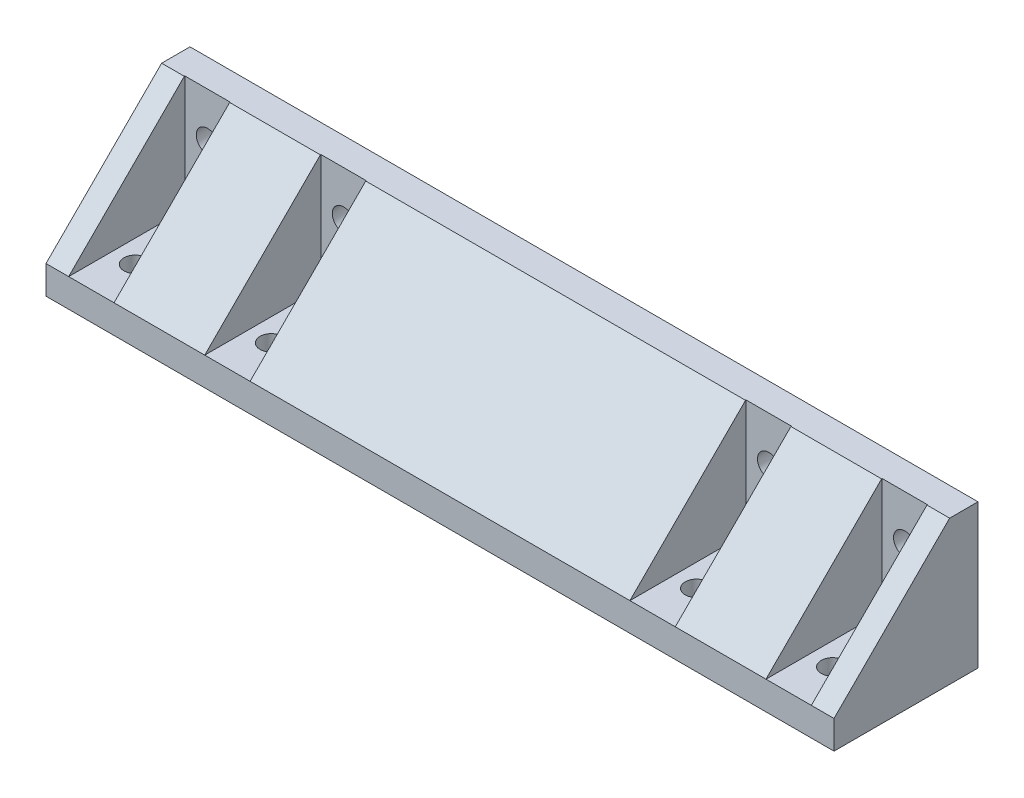
ISO-10303-21;
HEADER;
FILE_DESCRIPTION(('STEP AP214'),'2;1');
FILE_NAME('part.step','',(''),(''),'','','');
FILE_SCHEMA(('AUTOMOTIVE_DESIGN { 1 0 10303 214 1 1 1 1 }'));
ENDSEC;
DATA;
#1=APPLICATION_CONTEXT('core data for automotive mechanical design processes');
#2=APPLICATION_PROTOCOL_DEFINITION('international standard','automotive_design',2000,#1);
#3=PRODUCT_CONTEXT('',#1,'mechanical');
#4=PRODUCT('Part','Part','',(#3));
#5=PRODUCT_RELATED_PRODUCT_CATEGORY('part','',(#4));
#6=PRODUCT_DEFINITION_FORMATION('','',#4);
#7=PRODUCT_DEFINITION_CONTEXT('part definition',#1,'design');
#8=PRODUCT_DEFINITION('design','',#6,#7);
#9=PRODUCT_DEFINITION_SHAPE('','',#8);
#10=(LENGTH_UNIT() NAMED_UNIT(*) SI_UNIT(.MILLI.,.METRE.));
#11=(NAMED_UNIT(*) PLANE_ANGLE_UNIT() SI_UNIT($,.RADIAN.));
#12=(NAMED_UNIT(*) SI_UNIT($,.STERADIAN.) SOLID_ANGLE_UNIT());
#13=UNCERTAINTY_MEASURE_WITH_UNIT(LENGTH_MEASURE(1.E-05),#10,'distance_accuracy_value','');
#14=(GEOMETRIC_REPRESENTATION_CONTEXT(3) GLOBAL_UNCERTAINTY_ASSIGNED_CONTEXT((#13)) GLOBAL_UNIT_ASSIGNED_CONTEXT((#10,
#11,#12)) REPRESENTATION_CONTEXT('',''));
#15=CARTESIAN_POINT('',(0.,0.,0.));
#16=DIRECTION('',(0.,0.,1.));
#17=DIRECTION('',(1.,0.,0.));
#18=AXIS2_PLACEMENT_3D('',#15,#16,#17);
#19=CARTESIAN_POINT('',(0.,25.4,0.));
#20=DIRECTION('',(0.,1.,0.));
#21=DIRECTION('',(0.,0.,1.));
#22=AXIS2_PLACEMENT_3D('',#19,#20,#21);
#23=PLANE('',#22);
#24=DIRECTION('',(1.,0.,0.));
#25=VECTOR('',#24,1.);
#26=CARTESIAN_POINT('',(0.,25.4,-20.4));
#27=LINE('',#26,#25);
#28=CARTESIAN_POINT('',(0.,25.4,-20.4));
#29=VERTEX_POINT('',#28);
#30=CARTESIAN_POINT('',(4.,25.4,-20.4));
#31=VERTEX_POINT('',#30);
#32=EDGE_CURVE('E320',#29,#31,#27,.T.);
#33=ORIENTED_EDGE('',*,*,#32,.T.);
#34=DIRECTION('',(0.,0.,1.));
#35=VECTOR('',#34,1.);
#36=CARTESIAN_POINT('',(4.,25.4,-20.5));
#37=LINE('',#36,#35);
#38=CARTESIAN_POINT('',(4.,25.4,-20.5));
#39=VERTEX_POINT('',#38);
#40=EDGE_CURVE('E215',#39,#31,#37,.T.);
#41=ORIENTED_EDGE('',*,*,#40,.F.);
#42=DIRECTION('',(1.,0.,0.));
#43=VECTOR('',#42,1.);
#44=CARTESIAN_POINT('',(0.,25.4,-20.5));
#45=LINE('',#44,#43);
#46=CARTESIAN_POINT('',(12.,25.4,-20.5));
#47=VERTEX_POINT('',#46);
#48=EDGE_CURVE('E204',#39,#47,#45,.T.);
#49=ORIENTED_EDGE('',*,*,#48,.T.);
#50=DIRECTION('',(0.,0.,1.));
#51=VECTOR('',#50,1.);
#52=CARTESIAN_POINT('',(12.,25.4,-20.5));
#53=LINE('',#52,#51);
#54=CARTESIAN_POINT('',(12.,25.4,-20.4));
#55=VERTEX_POINT('',#54);
#56=EDGE_CURVE('E192',#47,#55,#53,.T.);
#57=ORIENTED_EDGE('',*,*,#56,.T.);
#58=CARTESIAN_POINT('',(28.,25.4,-20.4));
#59=VERTEX_POINT('',#58);
#60=EDGE_CURVE('E324',#55,#59,#27,.T.);
#61=ORIENTED_EDGE('',*,*,#60,.T.);
#62=DIRECTION('',(0.,0.,1.));
#63=VECTOR('',#62,1.);
#64=CARTESIAN_POINT('',(28.,25.4,-20.5));
#65=LINE('',#64,#63);
#66=CARTESIAN_POINT('',(28.,25.4,-20.5));
#67=VERTEX_POINT('',#66);
#68=EDGE_CURVE('E234',#67,#59,#65,.T.);
#69=ORIENTED_EDGE('',*,*,#68,.F.);
#70=DIRECTION('',(1.,0.,0.));
#71=VECTOR('',#70,1.);
#72=CARTESIAN_POINT('',(0.,25.4,-20.5));
#73=LINE('',#72,#71);
#74=CARTESIAN_POINT('',(36.,25.4,-20.5));
#75=VERTEX_POINT('',#74);
#76=EDGE_CURVE('E225',#67,#75,#73,.T.);
#77=ORIENTED_EDGE('',*,*,#76,.T.);
#78=DIRECTION('',(0.,0.,1.));
#79=VECTOR('',#78,1.);
#80=CARTESIAN_POINT('',(36.,25.4,-20.5));
#81=LINE('',#80,#79);
#82=CARTESIAN_POINT('',(36.,25.4,-20.4));
#83=VERTEX_POINT('',#82);
#84=EDGE_CURVE('E236',#75,#83,#81,.T.);
#85=ORIENTED_EDGE('',*,*,#84,.T.);
#86=CARTESIAN_POINT('',(103.,25.4,-20.4));
#87=VERTEX_POINT('',#86);
#88=EDGE_CURVE('E398',#83,#87,#27,.T.);
#89=ORIENTED_EDGE('',*,*,#88,.T.);
#90=DIRECTION('',(0.,0.,1.));
#91=VECTOR('',#90,1.);
#92=CARTESIAN_POINT('',(103.,25.4,-20.5));
#93=LINE('',#92,#91);
#94=CARTESIAN_POINT('',(103.,25.4,-20.5));
#95=VERTEX_POINT('',#94);
#96=EDGE_CURVE('E255',#95,#87,#93,.T.);
#97=ORIENTED_EDGE('',*,*,#96,.F.);
#98=DIRECTION('',(1.,0.,0.));
#99=VECTOR('',#98,1.);
#100=CARTESIAN_POINT('',(0.,25.4,-20.5));
#101=LINE('',#100,#99);
#102=CARTESIAN_POINT('',(111.,25.4,-20.5));
#103=VERTEX_POINT('',#102);
#104=EDGE_CURVE('E246',#95,#103,#101,.T.);
#105=ORIENTED_EDGE('',*,*,#104,.T.);
#106=DIRECTION('',(0.,0.,1.));
#107=VECTOR('',#106,1.);
#108=CARTESIAN_POINT('',(111.,25.4,-20.5));
#109=LINE('',#108,#107);
#110=CARTESIAN_POINT('',(111.,25.4,-20.4));
#111=VERTEX_POINT('',#110);
#112=EDGE_CURVE('E257',#103,#111,#109,.T.);
#113=ORIENTED_EDGE('',*,*,#112,.T.);
#114=CARTESIAN_POINT('',(127.,25.4,-20.4));
#115=VERTEX_POINT('',#114);
#116=EDGE_CURVE('E400',#111,#115,#27,.T.);
#117=ORIENTED_EDGE('',*,*,#116,.T.);
#118=DIRECTION('',(0.,0.,1.));
#119=VECTOR('',#118,1.);
#120=CARTESIAN_POINT('',(127.,25.4,-20.5));
#121=LINE('',#120,#119);
#122=CARTESIAN_POINT('',(127.,25.4,-20.5));
#123=VERTEX_POINT('',#122);
#124=EDGE_CURVE('E277',#123,#115,#121,.T.);
#125=ORIENTED_EDGE('',*,*,#124,.F.);
#126=DIRECTION('',(1.,0.,0.));
#127=VECTOR('',#126,1.);
#128=CARTESIAN_POINT('',(0.,25.4,-20.5));
#129=LINE('',#128,#127);
#130=CARTESIAN_POINT('',(135.,25.4,-20.5));
#131=VERTEX_POINT('',#130);
#132=EDGE_CURVE('E267',#123,#131,#129,.T.);
#133=ORIENTED_EDGE('',*,*,#132,.T.);
#134=DIRECTION('',(0.,0.,1.));
#135=VECTOR('',#134,1.);
#136=CARTESIAN_POINT('',(135.,25.4,-20.5));
#137=LINE('',#136,#135);
#138=CARTESIAN_POINT('',(135.,25.4,-20.4));
#139=VERTEX_POINT('',#138);
#140=EDGE_CURVE('E279',#131,#139,#137,.T.);
#141=ORIENTED_EDGE('',*,*,#140,.T.);
#142=CARTESIAN_POINT('',(139.,25.4,-20.4));
#143=VERTEX_POINT('',#142);
#144=EDGE_CURVE('E319',#139,#143,#27,.T.);
#145=ORIENTED_EDGE('',*,*,#144,.T.);
#146=DIRECTION('',(0.,0.,-1.));
#147=VECTOR('',#146,1.);
#148=CARTESIAN_POINT('',(139.,25.4,-25.4));
#149=LINE('',#148,#147);
#150=CARTESIAN_POINT('',(139.,25.4,-25.4));
#151=VERTEX_POINT('',#150);
#152=EDGE_CURVE('E323',#143,#151,#149,.T.);
#153=ORIENTED_EDGE('',*,*,#152,.T.);
#154=DIRECTION('',(-1.,0.,0.));
#155=VECTOR('',#154,1.);
#156=CARTESIAN_POINT('',(0.,25.4,-25.4));
#157=LINE('',#156,#155);
#158=CARTESIAN_POINT('',(0.,25.4,-25.4));
#159=VERTEX_POINT('',#158);
#160=EDGE_CURVE('E327',#151,#159,#157,.T.);
#161=ORIENTED_EDGE('',*,*,#160,.T.);
#162=DIRECTION('',(0.,0.,1.));
#163=VECTOR('',#162,1.);
#164=CARTESIAN_POINT('',(0.,25.4,-25.4));
#165=LINE('',#164,#163);
#166=EDGE_CURVE('E294',#159,#29,#165,.T.);
#167=ORIENTED_EDGE('',*,*,#166,.T.);
#168=EDGE_LOOP('',(#33,#41,#49,#57,#61,#69,#77,#85,#89,#97,#105,#113,#117,#125,#133,#141,#145,
#153,#161,#167));
#169=FACE_BOUND('',#168,.T.);
#170=ADVANCED_FACE('F35',(#169),#23,.T.);
#171=CARTESIAN_POINT('',(0.,2.5,2.5));
#172=DIRECTION('',(0.,0.707106781186548,0.707106781186548));
#173=DIRECTION('',(0.,-0.707106781186548,0.707106781186548));
#174=AXIS2_PLACEMENT_3D('',#171,#172,#173);
#175=PLANE('',#174);
#176=DIRECTION('',(1.,0.,0.));
#177=VECTOR('',#176,1.);
#178=CARTESIAN_POINT('',(0.,5.,0.));
#179=LINE('',#178,#177);
#180=CARTESIAN_POINT('',(0.,5.,0.));
#181=VERTEX_POINT('',#180);
#182=CARTESIAN_POINT('',(4.,5.,0.));
#183=VERTEX_POINT('',#182);
#184=EDGE_CURVE('E287',#181,#183,#179,.T.);
#185=ORIENTED_EDGE('',*,*,#184,.T.);
#186=DIRECTION('',(0.,0.707106781186548,-0.707106781186548));
#187=VECTOR('',#186,1.);
#188=CARTESIAN_POINT('',(4.,2.5,2.5));
#189=LINE('',#188,#187);
#190=EDGE_CURVE('E11',#183,#31,#189,.T.);
#191=ORIENTED_EDGE('',*,*,#190,.T.);
#192=ORIENTED_EDGE('',*,*,#32,.F.);
#193=DIRECTION('',(0.,-0.707106781186548,0.707106781186548));
#194=VECTOR('',#193,1.);
#195=CARTESIAN_POINT('',(0.,2.5,2.5));
#196=LINE('',#195,#194);
#197=EDGE_CURVE('E283',#29,#181,#196,.T.);
#198=ORIENTED_EDGE('',*,*,#197,.T.);
#199=EDGE_LOOP('',(#185,#191,#192,#198));
#200=FACE_BOUND('',#199,.T.);
#201=ADVANCED_FACE('F429',(#200),#175,.T.);
#202=DIRECTION('',(0.,0.707106781186548,-0.707106781186548));
#203=VECTOR('',#202,1.);
#204=CARTESIAN_POINT('',(12.,2.5,2.5));
#205=LINE('',#204,#203);
#206=CARTESIAN_POINT('',(12.,5.,0.));
#207=VERTEX_POINT('',#206);
#208=EDGE_CURVE('E43',#207,#55,#205,.T.);
#209=ORIENTED_EDGE('',*,*,#208,.F.);
#210=CARTESIAN_POINT('',(28.,5.,0.));
#211=VERTEX_POINT('',#210);
#212=EDGE_CURVE('E291',#207,#211,#179,.T.);
#213=ORIENTED_EDGE('',*,*,#212,.T.);
#214=DIRECTION('',(0.,0.707106781186548,-0.707106781186548));
#215=VECTOR('',#214,1.);
#216=CARTESIAN_POINT('',(28.,2.5,2.5));
#217=LINE('',#216,#215);
#218=EDGE_CURVE('E386',#211,#59,#217,.T.);
#219=ORIENTED_EDGE('',*,*,#218,.T.);
#220=ORIENTED_EDGE('',*,*,#60,.F.);
#221=EDGE_LOOP('',(#209,#213,#219,#220));
#222=FACE_BOUND('',#221,.T.);
#223=ADVANCED_FACE('F396',(#222),#175,.T.);
#224=DIRECTION('',(0.,0.707106781186548,-0.707106781186548));
#225=VECTOR('',#224,1.);
#226=CARTESIAN_POINT('',(36.,2.5,2.5));
#227=LINE('',#226,#225);
#228=CARTESIAN_POINT('',(36.,5.,0.));
#229=VERTEX_POINT('',#228);
#230=EDGE_CURVE('E384',#229,#83,#227,.T.);
#231=ORIENTED_EDGE('',*,*,#230,.F.);
#232=CARTESIAN_POINT('',(103.,5.,0.));
#233=VERTEX_POINT('',#232);
#234=EDGE_CURVE('E434',#229,#233,#179,.T.);
#235=ORIENTED_EDGE('',*,*,#234,.T.);
#236=DIRECTION('',(0.,0.707106781186548,-0.707106781186548));
#237=VECTOR('',#236,1.);
#238=CARTESIAN_POINT('',(103.,2.5,2.5));
#239=LINE('',#238,#237);
#240=EDGE_CURVE('E381',#233,#87,#239,.T.);
#241=ORIENTED_EDGE('',*,*,#240,.T.);
#242=ORIENTED_EDGE('',*,*,#88,.F.);
#243=EDGE_LOOP('',(#231,#235,#241,#242));
#244=FACE_BOUND('',#243,.T.);
#245=ADVANCED_FACE('F518',(#244),#175,.T.);
#246=DIRECTION('',(0.,0.707106781186548,-0.707106781186548));
#247=VECTOR('',#246,1.);
#248=CARTESIAN_POINT('',(111.,2.5,2.5));
#249=LINE('',#248,#247);
#250=CARTESIAN_POINT('',(111.,5.,0.));
#251=VERTEX_POINT('',#250);
#252=EDGE_CURVE('E379',#251,#111,#249,.T.);
#253=ORIENTED_EDGE('',*,*,#252,.F.);
#254=CARTESIAN_POINT('',(127.,5.,0.));
#255=VERTEX_POINT('',#254);
#256=EDGE_CURVE('E436',#251,#255,#179,.T.);
#257=ORIENTED_EDGE('',*,*,#256,.T.);
#258=DIRECTION('',(0.,0.707106781186548,-0.707106781186548));
#259=VECTOR('',#258,1.);
#260=CARTESIAN_POINT('',(127.,2.5,2.5));
#261=LINE('',#260,#259);
#262=EDGE_CURVE('E376',#255,#115,#261,.T.);
#263=ORIENTED_EDGE('',*,*,#262,.T.);
#264=ORIENTED_EDGE('',*,*,#116,.F.);
#265=EDGE_LOOP('',(#253,#257,#263,#264));
#266=FACE_BOUND('',#265,.T.);
#267=ADVANCED_FACE('F443',(#266),#175,.T.);
#268=CARTESIAN_POINT('',(0.,5.,0.));
#269=DIRECTION('',(0.,0.,-1.));
#270=DIRECTION('',(-1.,0.,0.));
#271=AXIS2_PLACEMENT_3D('',#268,#269,#270);
#272=PLANE('',#271);
#273=ORIENTED_EDGE('',*,*,#184,.F.);
#274=DIRECTION('',(0.,-1.,0.));
#275=VECTOR('',#274,1.);
#276=CARTESIAN_POINT('',(0.,5.,0.));
#277=LINE('',#276,#275);
#278=CARTESIAN_POINT('',(0.,0.,0.));
#279=VERTEX_POINT('',#278);
#280=EDGE_CURVE('E366',#181,#279,#277,.T.);
#281=ORIENTED_EDGE('',*,*,#280,.T.);
#282=DIRECTION('',(1.,0.,0.));
#283=VECTOR('',#282,1.);
#284=CARTESIAN_POINT('',(0.,0.,0.));
#285=LINE('',#284,#283);
#286=CARTESIAN_POINT('',(139.,0.,0.));
#287=VERTEX_POINT('',#286);
#288=EDGE_CURVE('E330',#279,#287,#285,.T.);
#289=ORIENTED_EDGE('',*,*,#288,.T.);
#290=DIRECTION('',(0.,-1.,0.));
#291=VECTOR('',#290,1.);
#292=CARTESIAN_POINT('',(139.,5.,0.));
#293=LINE('',#292,#291);
#294=CARTESIAN_POINT('',(139.,5.,0.));
#295=VERTEX_POINT('',#294);
#296=EDGE_CURVE('E372',#295,#287,#293,.T.);
#297=ORIENTED_EDGE('',*,*,#296,.F.);
#298=CARTESIAN_POINT('',(135.,5.,0.));
#299=VERTEX_POINT('',#298);
#300=EDGE_CURVE('E285',#299,#295,#179,.T.);
#301=ORIENTED_EDGE('',*,*,#300,.F.);
#302=DIRECTION('',(-1.,0.,0.));
#303=VECTOR('',#302,1.);
#304=CARTESIAN_POINT('',(0.,5.,0.));
#305=LINE('',#304,#303);
#306=EDGE_CURVE('E264',#299,#255,#305,.T.);
#307=ORIENTED_EDGE('',*,*,#306,.T.);
#308=ORIENTED_EDGE('',*,*,#256,.F.);
#309=DIRECTION('',(-1.,0.,0.));
#310=VECTOR('',#309,1.);
#311=CARTESIAN_POINT('',(0.,5.,0.));
#312=LINE('',#311,#310);
#313=EDGE_CURVE('E243',#251,#233,#312,.T.);
#314=ORIENTED_EDGE('',*,*,#313,.T.);
#315=ORIENTED_EDGE('',*,*,#234,.F.);
#316=DIRECTION('',(-1.,0.,0.));
#317=VECTOR('',#316,1.);
#318=CARTESIAN_POINT('',(0.,5.,0.));
#319=LINE('',#318,#317);
#320=EDGE_CURVE('E222',#229,#211,#319,.T.);
#321=ORIENTED_EDGE('',*,*,#320,.T.);
#322=ORIENTED_EDGE('',*,*,#212,.F.);
#323=DIRECTION('',(-1.,0.,0.));
#324=VECTOR('',#323,1.);
#325=CARTESIAN_POINT('',(0.,5.,0.));
#326=LINE('',#325,#324);
#327=EDGE_CURVE('E188',#207,#183,#326,.T.);
#328=ORIENTED_EDGE('',*,*,#327,.T.);
#329=EDGE_LOOP('',(#273,#281,#289,#297,#301,#307,#308,#314,#315,#321,#322,#328));
#330=FACE_BOUND('',#329,.T.);
#331=ADVANCED_FACE('F37',(#330),#272,.F.);
#332=CARTESIAN_POINT('',(139.,5.,0.));
#333=DIRECTION('',(-1.,0.,0.));
#334=DIRECTION('',(0.,0.,1.));
#335=AXIS2_PLACEMENT_3D('',#332,#333,#334);
#336=PLANE('',#335);
#337=DIRECTION('',(0.,0.707106781186548,-0.707106781186548));
#338=VECTOR('',#337,1.);
#339=CARTESIAN_POINT('',(139.,5.,0.));
#340=LINE('',#339,#338);
#341=EDGE_CURVE('E290',#295,#143,#340,.T.);
#342=ORIENTED_EDGE('',*,*,#341,.F.);
#343=ORIENTED_EDGE('',*,*,#296,.T.);
#344=DIRECTION('',(0.,0.,-1.));
#345=VECTOR('',#344,1.);
#346=CARTESIAN_POINT('',(139.,0.,0.));
#347=LINE('',#346,#345);
#348=CARTESIAN_POINT('',(139.,0.,-25.4));
#349=VERTEX_POINT('',#348);
#350=EDGE_CURVE('E333',#287,#349,#347,.T.);
#351=ORIENTED_EDGE('',*,*,#350,.T.);
#352=DIRECTION('',(0.,-1.,0.));
#353=VECTOR('',#352,1.);
#354=CARTESIAN_POINT('',(139.,5.,-25.4));
#355=LINE('',#354,#353);
#356=EDGE_CURVE('E370',#151,#349,#355,.T.);
#357=ORIENTED_EDGE('',*,*,#356,.F.);
#358=ORIENTED_EDGE('',*,*,#152,.F.);
#359=EDGE_LOOP('',(#342,#343,#351,#357,#358));
#360=FACE_BOUND('',#359,.T.);
#361=ADVANCED_FACE('F416',(#360),#336,.F.);
#362=CARTESIAN_POINT('',(0.,5.,0.));
#363=DIRECTION('',(-1.,0.,0.));
#364=DIRECTION('',(0.,0.,1.));
#365=AXIS2_PLACEMENT_3D('',#362,#363,#364);
#366=PLANE('',#365);
#367=ORIENTED_EDGE('',*,*,#280,.F.);
#368=ORIENTED_EDGE('',*,*,#197,.F.);
#369=ORIENTED_EDGE('',*,*,#166,.F.);
#370=DIRECTION('',(0.,-1.,0.));
#371=VECTOR('',#370,1.);
#372=CARTESIAN_POINT('',(0.,5.,-25.4));
#373=LINE('',#372,#371);
#374=CARTESIAN_POINT('',(0.,0.,-25.4));
#375=VERTEX_POINT('',#374);
#376=EDGE_CURVE('E368',#159,#375,#373,.T.);
#377=ORIENTED_EDGE('',*,*,#376,.T.);
#378=DIRECTION('',(0.,0.,-1.));
#379=VECTOR('',#378,1.);
#380=CARTESIAN_POINT('',(0.,0.,0.));
#381=LINE('',#380,#379);
#382=EDGE_CURVE('E339',#279,#375,#381,.T.);
#383=ORIENTED_EDGE('',*,*,#382,.F.);
#384=EDGE_LOOP('',(#367,#368,#369,#377,#383));
#385=FACE_BOUND('',#384,.T.);
#386=ADVANCED_FACE('F425',(#385),#366,.T.);
#387=CARTESIAN_POINT('',(0.,5.,-25.4));
#388=DIRECTION('',(0.,0.,-1.));
#389=DIRECTION('',(-1.,0.,0.));
#390=AXIS2_PLACEMENT_3D('',#387,#388,#389);
#391=PLANE('',#390);
#392=CARTESIAN_POINT('',(131.,17.4,-25.4));
#393=DIRECTION('',(0.,0.,-1.));
#394=DIRECTION('',(-1.,0.,0.));
#395=AXIS2_PLACEMENT_3D('',#392,#393,#394);
#396=CIRCLE('',#395,2.);
#397=CARTESIAN_POINT('',(129.,17.4,-25.4));
#398=VERTEX_POINT('',#397);
#399=EDGE_CURVE('E275',#398,#398,#396,.T.);
#400=ORIENTED_EDGE('',*,*,#399,.F.);
#401=EDGE_LOOP('',(#400));
#402=FACE_BOUND('',#401,.T.);
#403=CARTESIAN_POINT('',(8.,17.4,-25.4));
#404=DIRECTION('',(0.,0.,-1.));
#405=DIRECTION('',(-1.,0.,0.));
#406=AXIS2_PLACEMENT_3D('',#403,#404,#405);
#407=CIRCLE('',#406,2.);
#408=CARTESIAN_POINT('',(6.,17.4,-25.4));
#409=VERTEX_POINT('',#408);
#410=EDGE_CURVE('E715',#409,#409,#407,.T.);
#411=ORIENTED_EDGE('',*,*,#410,.F.);
#412=EDGE_LOOP('',(#411));
#413=FACE_BOUND('',#412,.T.);
#414=CARTESIAN_POINT('',(32.,17.4,-25.4));
#415=DIRECTION('',(0.,0.,-1.));
#416=DIRECTION('',(-1.,0.,0.));
#417=AXIS2_PLACEMENT_3D('',#414,#415,#416);
#418=CIRCLE('',#417,2.);
#419=CARTESIAN_POINT('',(30.,17.4,-25.4));
#420=VERTEX_POINT('',#419);
#421=EDGE_CURVE('E719',#420,#420,#418,.T.);
#422=ORIENTED_EDGE('',*,*,#421,.F.);
#423=EDGE_LOOP('',(#422));
#424=FACE_BOUND('',#423,.T.);
#425=CARTESIAN_POINT('',(107.,17.4,-25.4));
#426=DIRECTION('',(0.,0.,-1.));
#427=DIRECTION('',(-1.,0.,0.));
#428=AXIS2_PLACEMENT_3D('',#425,#426,#427);
#429=CIRCLE('',#428,2.);
#430=CARTESIAN_POINT('',(105.,17.4,-25.4));
#431=VERTEX_POINT('',#430);
#432=EDGE_CURVE('E732',#431,#431,#429,.T.);
#433=ORIENTED_EDGE('',*,*,#432,.F.);
#434=EDGE_LOOP('',(#433));
#435=FACE_BOUND('',#434,.T.);
#436=DIRECTION('',(1.,0.,0.));
#437=VECTOR('',#436,1.);
#438=CARTESIAN_POINT('',(0.,0.,-25.4));
#439=LINE('',#438,#437);
#440=EDGE_CURVE('E336',#375,#349,#439,.T.);
#441=ORIENTED_EDGE('',*,*,#440,.F.);
#442=ORIENTED_EDGE('',*,*,#376,.F.);
#443=ORIENTED_EDGE('',*,*,#160,.F.);
#444=ORIENTED_EDGE('',*,*,#356,.T.);
#445=EDGE_LOOP('',(#441,#442,#443,#444));
#446=FACE_BOUND('',#445,.T.);
#447=ADVANCED_FACE('F420',(#402,#413,#424,#435,#446),#391,.T.);
#448=CARTESIAN_POINT('',(107.,5.,-7.75));
#449=DIRECTION('',(0.,-1.,0.));
#450=DIRECTION('',(0.,0.,-1.));
#451=AXIS2_PLACEMENT_3D('',#448,#449,#450);
#452=CYLINDRICAL_SURFACE('',#451,2.);
#453=CARTESIAN_POINT('',(107.,5.,-7.75));
#454=DIRECTION('',(0.,1.,0.));
#455=DIRECTION('',(0.,0.,1.));
#456=AXIS2_PLACEMENT_3D('',#453,#454,#455);
#457=CIRCLE('',#456,2.);
#458=CARTESIAN_POINT('',(107.,5.,-5.75));
#459=VERTEX_POINT('',#458);
#460=EDGE_CURVE('E301',#459,#459,#457,.T.);
#461=ORIENTED_EDGE('',*,*,#460,.T.);
#462=EDGE_LOOP('',(#461));
#463=FACE_BOUND('',#462,.T.);
#464=CARTESIAN_POINT('',(107.,0.,-7.75));
#465=DIRECTION('',(0.,1.,0.));
#466=DIRECTION('',(0.,0.,1.));
#467=AXIS2_PLACEMENT_3D('',#464,#465,#466);
#468=CIRCLE('',#467,2.);
#469=CARTESIAN_POINT('',(107.,0.,-5.75));
#470=VERTEX_POINT('',#469);
#471=EDGE_CURVE('E360',#470,#470,#468,.T.);
#472=ORIENTED_EDGE('',*,*,#471,.F.);
#473=EDGE_LOOP('',(#472));
#474=FACE_BOUND('',#473,.T.);
#475=ADVANCED_FACE('F480',(#463,#474),#452,.F.);
#476=CARTESIAN_POINT('',(32.,5.,-7.75));
#477=DIRECTION('',(0.,-1.,0.));
#478=DIRECTION('',(0.,0.,-1.));
#479=AXIS2_PLACEMENT_3D('',#476,#477,#478);
#480=CYLINDRICAL_SURFACE('',#479,2.);
#481=CARTESIAN_POINT('',(32.,5.,-7.75));
#482=DIRECTION('',(0.,1.,0.));
#483=DIRECTION('',(0.,0.,1.));
#484=AXIS2_PLACEMENT_3D('',#481,#482,#483);
#485=CIRCLE('',#484,2.);
#486=CARTESIAN_POINT('',(32.,5.,-5.75));
#487=VERTEX_POINT('',#486);
#488=EDGE_CURVE('E307',#487,#487,#485,.T.);
#489=ORIENTED_EDGE('',*,*,#488,.T.);
#490=EDGE_LOOP('',(#489));
#491=FACE_BOUND('',#490,.T.);
#492=CARTESIAN_POINT('',(32.,0.,-7.75));
#493=DIRECTION('',(0.,1.,0.));
#494=DIRECTION('',(0.,0.,1.));
#495=AXIS2_PLACEMENT_3D('',#492,#493,#494);
#496=CIRCLE('',#495,2.);
#497=CARTESIAN_POINT('',(32.,0.,-5.75));
#498=VERTEX_POINT('',#497);
#499=EDGE_CURVE('E357',#498,#498,#496,.T.);
#500=ORIENTED_EDGE('',*,*,#499,.F.);
#501=EDGE_LOOP('',(#500));
#502=FACE_BOUND('',#501,.T.);
#503=ADVANCED_FACE('F483',(#491,#502),#480,.F.);
#504=CARTESIAN_POINT('',(8.,5.,-7.75));
#505=DIRECTION('',(0.,-1.,0.));
#506=DIRECTION('',(0.,0.,-1.));
#507=AXIS2_PLACEMENT_3D('',#504,#505,#506);
#508=CYLINDRICAL_SURFACE('',#507,2.);
#509=CARTESIAN_POINT('',(8.,5.,-7.75));
#510=DIRECTION('',(0.,1.,0.));
#511=DIRECTION('',(0.,0.,1.));
#512=AXIS2_PLACEMENT_3D('',#509,#510,#511);
#513=CIRCLE('',#512,2.);
#514=CARTESIAN_POINT('',(8.,5.,-5.75));
#515=VERTEX_POINT('',#514);
#516=EDGE_CURVE('E297',#515,#515,#513,.T.);
#517=ORIENTED_EDGE('',*,*,#516,.T.);
#518=EDGE_LOOP('',(#517));
#519=FACE_BOUND('',#518,.T.);
#520=CARTESIAN_POINT('',(8.,0.,-7.75));
#521=DIRECTION('',(0.,1.,0.));
#522=DIRECTION('',(0.,0.,1.));
#523=AXIS2_PLACEMENT_3D('',#520,#521,#522);
#524=CIRCLE('',#523,2.);
#525=CARTESIAN_POINT('',(8.,0.,-5.75));
#526=VERTEX_POINT('',#525);
#527=EDGE_CURVE('E354',#526,#526,#524,.T.);
#528=ORIENTED_EDGE('',*,*,#527,.F.);
#529=EDGE_LOOP('',(#528));
#530=FACE_BOUND('',#529,.T.);
#531=ADVANCED_FACE('F487',(#519,#530),#508,.F.);
#532=CARTESIAN_POINT('',(32.,5.,-15.75));
#533=DIRECTION('',(0.,-1.,0.));
#534=DIRECTION('',(0.,0.,-1.));
#535=AXIS2_PLACEMENT_3D('',#532,#533,#534);
#536=CYLINDRICAL_SURFACE('',#535,2.);
#537=CARTESIAN_POINT('',(32.,5.,-15.75));
#538=DIRECTION('',(0.,1.,0.));
#539=DIRECTION('',(0.,0.,1.));
#540=AXIS2_PLACEMENT_3D('',#537,#538,#539);
#541=CIRCLE('',#540,2.);
#542=CARTESIAN_POINT('',(32.,5.,-13.75));
#543=VERTEX_POINT('',#542);
#544=EDGE_CURVE('E308',#543,#543,#541,.T.);
#545=ORIENTED_EDGE('',*,*,#544,.T.);
#546=EDGE_LOOP('',(#545));
#547=FACE_BOUND('',#546,.T.);
#548=CARTESIAN_POINT('',(32.,0.,-15.75));
#549=DIRECTION('',(0.,1.,0.));
#550=DIRECTION('',(0.,0.,1.));
#551=AXIS2_PLACEMENT_3D('',#548,#549,#550);
#552=CIRCLE('',#551,2.);
#553=CARTESIAN_POINT('',(32.,0.,-13.75));
#554=VERTEX_POINT('',#553);
#555=EDGE_CURVE('E351',#554,#554,#552,.T.);
#556=ORIENTED_EDGE('',*,*,#555,.F.);
#557=EDGE_LOOP('',(#556));
#558=FACE_BOUND('',#557,.T.);
#559=ADVANCED_FACE('F491',(#547,#558),#536,.F.);
#560=CARTESIAN_POINT('',(107.,5.,-15.75));
#561=DIRECTION('',(0.,-1.,0.));
#562=DIRECTION('',(0.,0.,-1.));
#563=AXIS2_PLACEMENT_3D('',#560,#561,#562);
#564=CYLINDRICAL_SURFACE('',#563,2.);
#565=CARTESIAN_POINT('',(107.,5.,-15.75));
#566=DIRECTION('',(0.,1.,0.));
#567=DIRECTION('',(0.,0.,1.));
#568=AXIS2_PLACEMENT_3D('',#565,#566,#567);
#569=CIRCLE('',#568,2.);
#570=CARTESIAN_POINT('',(107.,5.,-13.75));
#571=VERTEX_POINT('',#570);
#572=EDGE_CURVE('E304',#571,#571,#569,.T.);
#573=ORIENTED_EDGE('',*,*,#572,.T.);
#574=EDGE_LOOP('',(#573));
#575=FACE_BOUND('',#574,.T.);
#576=CARTESIAN_POINT('',(107.,0.,-15.75));
#577=DIRECTION('',(0.,1.,0.));
#578=DIRECTION('',(0.,0.,1.));
#579=AXIS2_PLACEMENT_3D('',#576,#577,#578);
#580=CIRCLE('',#579,2.);
#581=CARTESIAN_POINT('',(107.,0.,-13.75));
#582=VERTEX_POINT('',#581);
#583=EDGE_CURVE('E348',#582,#582,#580,.T.);
#584=ORIENTED_EDGE('',*,*,#583,.F.);
#585=EDGE_LOOP('',(#584));
#586=FACE_BOUND('',#585,.T.);
#587=ADVANCED_FACE('F495',(#575,#586),#564,.F.);
#588=CARTESIAN_POINT('',(131.,5.,-15.75));
#589=DIRECTION('',(0.,-1.,0.));
#590=DIRECTION('',(0.,0.,-1.));
#591=AXIS2_PLACEMENT_3D('',#588,#589,#590);
#592=CYLINDRICAL_SURFACE('',#591,2.);
#593=CARTESIAN_POINT('',(131.,5.,-15.75));
#594=DIRECTION('',(0.,1.,0.));
#595=DIRECTION('',(0.,0.,1.));
#596=AXIS2_PLACEMENT_3D('',#593,#594,#595);
#597=CIRCLE('',#596,2.);
#598=CARTESIAN_POINT('',(131.,5.,-13.75));
#599=VERTEX_POINT('',#598);
#600=EDGE_CURVE('E214',#599,#599,#597,.T.);
#601=ORIENTED_EDGE('',*,*,#600,.T.);
#602=EDGE_LOOP('',(#601));
#603=FACE_BOUND('',#602,.T.);
#604=CARTESIAN_POINT('',(131.,0.,-15.75));
#605=DIRECTION('',(0.,1.,0.));
#606=DIRECTION('',(0.,0.,1.));
#607=AXIS2_PLACEMENT_3D('',#604,#605,#606);
#608=CIRCLE('',#607,2.);
#609=CARTESIAN_POINT('',(131.,0.,-13.75));
#610=VERTEX_POINT('',#609);
#611=EDGE_CURVE('E345',#610,#610,#608,.T.);
#612=ORIENTED_EDGE('',*,*,#611,.F.);
#613=EDGE_LOOP('',(#612));
#614=FACE_BOUND('',#613,.T.);
#615=ADVANCED_FACE('F499',(#603,#614),#592,.F.);
#616=CARTESIAN_POINT('',(131.,5.,-7.75));
#617=DIRECTION('',(0.,-1.,0.));
#618=DIRECTION('',(0.,0.,-1.));
#619=AXIS2_PLACEMENT_3D('',#616,#617,#618);
#620=CYLINDRICAL_SURFACE('',#619,2.);
#621=CARTESIAN_POINT('',(131.,5.,-7.75));
#622=DIRECTION('',(0.,1.,0.));
#623=DIRECTION('',(0.,0.,1.));
#624=AXIS2_PLACEMENT_3D('',#621,#622,#623);
#625=CIRCLE('',#624,2.);
#626=CARTESIAN_POINT('',(131.,5.,-5.75));
#627=VERTEX_POINT('',#626);
#628=EDGE_CURVE('E298',#627,#627,#625,.T.);
#629=ORIENTED_EDGE('',*,*,#628,.T.);
#630=EDGE_LOOP('',(#629));
#631=FACE_BOUND('',#630,.T.);
#632=CARTESIAN_POINT('',(131.,0.,-7.75));
#633=DIRECTION('',(0.,1.,0.));
#634=DIRECTION('',(0.,0.,1.));
#635=AXIS2_PLACEMENT_3D('',#632,#633,#634);
#636=CIRCLE('',#635,2.);
#637=CARTESIAN_POINT('',(131.,0.,-5.75));
#638=VERTEX_POINT('',#637);
#639=EDGE_CURVE('E342',#638,#638,#636,.T.);
#640=ORIENTED_EDGE('',*,*,#639,.F.);
#641=EDGE_LOOP('',(#640));
#642=FACE_BOUND('',#641,.T.);
#643=ADVANCED_FACE('F478',(#631,#642),#620,.F.);
#644=CARTESIAN_POINT('',(8.,5.,-15.75));
#645=DIRECTION('',(0.,-1.,0.));
#646=DIRECTION('',(0.,0.,-1.));
#647=AXIS2_PLACEMENT_3D('',#644,#645,#646);
#648=CYLINDRICAL_SURFACE('',#647,2.);
#649=CARTESIAN_POINT('',(8.,5.,-15.75));
#650=DIRECTION('',(0.,1.,0.));
#651=DIRECTION('',(0.,0.,1.));
#652=AXIS2_PLACEMENT_3D('',#649,#650,#651);
#653=CIRCLE('',#652,2.);
#654=CARTESIAN_POINT('',(8.,5.,-13.75));
#655=VERTEX_POINT('',#654);
#656=EDGE_CURVE('E286',#655,#655,#653,.T.);
#657=ORIENTED_EDGE('',*,*,#656,.T.);
#658=EDGE_LOOP('',(#657));
#659=FACE_BOUND('',#658,.T.);
#660=CARTESIAN_POINT('',(8.,0.,-15.75));
#661=DIRECTION('',(0.,1.,0.));
#662=DIRECTION('',(0.,0.,1.));
#663=AXIS2_PLACEMENT_3D('',#660,#661,#662);
#664=CIRCLE('',#663,2.);
#665=CARTESIAN_POINT('',(8.,0.,-13.75));
#666=VERTEX_POINT('',#665);
#667=EDGE_CURVE('E363',#666,#666,#664,.T.);
#668=ORIENTED_EDGE('',*,*,#667,.F.);
#669=EDGE_LOOP('',(#668));
#670=FACE_BOUND('',#669,.T.);
#671=ADVANCED_FACE('F474',(#659,#670),#648,.F.);
#672=CARTESIAN_POINT('',(0.,0.,0.));
#673=DIRECTION('',(0.,1.,0.));
#674=DIRECTION('',(0.,0.,1.));
#675=AXIS2_PLACEMENT_3D('',#672,#673,#674);
#676=PLANE('',#675);
#677=ORIENTED_EDGE('',*,*,#288,.F.);
#678=ORIENTED_EDGE('',*,*,#382,.T.);
#679=ORIENTED_EDGE('',*,*,#440,.T.);
#680=ORIENTED_EDGE('',*,*,#350,.F.);
#681=EDGE_LOOP('',(#677,#678,#679,#680));
#682=FACE_BOUND('',#681,.T.);
#683=ORIENTED_EDGE('',*,*,#639,.T.);
#684=EDGE_LOOP('',(#683));
#685=FACE_BOUND('',#684,.T.);
#686=ORIENTED_EDGE('',*,*,#611,.T.);
#687=EDGE_LOOP('',(#686));
#688=FACE_BOUND('',#687,.T.);
#689=ORIENTED_EDGE('',*,*,#583,.T.);
#690=EDGE_LOOP('',(#689));
#691=FACE_BOUND('',#690,.T.);
#692=ORIENTED_EDGE('',*,*,#555,.T.);
#693=EDGE_LOOP('',(#692));
#694=FACE_BOUND('',#693,.T.);
#695=ORIENTED_EDGE('',*,*,#527,.T.);
#696=EDGE_LOOP('',(#695));
#697=FACE_BOUND('',#696,.T.);
#698=ORIENTED_EDGE('',*,*,#499,.T.);
#699=EDGE_LOOP('',(#698));
#700=FACE_BOUND('',#699,.T.);
#701=ORIENTED_EDGE('',*,*,#471,.T.);
#702=EDGE_LOOP('',(#701));
#703=FACE_BOUND('',#702,.T.);
#704=ORIENTED_EDGE('',*,*,#667,.T.);
#705=EDGE_LOOP('',(#704));
#706=FACE_BOUND('',#705,.T.);
#707=ADVANCED_FACE('F471',(#682,#685,#688,#691,#694,#697,#700,#703,#706),#676,.F.);
#708=DIRECTION('',(0.,0.707106781186548,-0.707106781186548));
#709=VECTOR('',#708,1.);
#710=CARTESIAN_POINT('',(135.,2.5,2.5));
#711=LINE('',#710,#709);
#712=EDGE_CURVE('E374',#299,#139,#711,.T.);
#713=ORIENTED_EDGE('',*,*,#712,.F.);
#714=ORIENTED_EDGE('',*,*,#300,.T.);
#715=ORIENTED_EDGE('',*,*,#341,.T.);
#716=ORIENTED_EDGE('',*,*,#144,.F.);
#717=EDGE_LOOP('',(#713,#714,#715,#716));
#718=FACE_BOUND('',#717,.T.);
#719=ADVANCED_FACE('F412',(#718),#175,.T.);
#720=CARTESIAN_POINT('',(0.,5.,-20.5));
#721=DIRECTION('',(0.,1.,0.));
#722=DIRECTION('',(0.,0.,1.));
#723=AXIS2_PLACEMENT_3D('',#720,#721,#722);
#724=PLANE('',#723);
#725=ORIENTED_EDGE('',*,*,#628,.F.);
#726=EDGE_LOOP('',(#725));
#727=FACE_BOUND('',#726,.T.);
#728=ORIENTED_EDGE('',*,*,#600,.F.);
#729=EDGE_LOOP('',(#728));
#730=FACE_BOUND('',#729,.T.);
#731=ORIENTED_EDGE('',*,*,#306,.F.);
#732=DIRECTION('',(0.,0.,1.));
#733=VECTOR('',#732,1.);
#734=CARTESIAN_POINT('',(135.,5.,-20.5));
#735=LINE('',#734,#733);
#736=CARTESIAN_POINT('',(135.,5.,-20.5));
#737=VERTEX_POINT('',#736);
#738=EDGE_CURVE('E272',#737,#299,#735,.T.);
#739=ORIENTED_EDGE('',*,*,#738,.F.);
#740=DIRECTION('',(-1.,0.,0.));
#741=VECTOR('',#740,1.);
#742=CARTESIAN_POINT('',(0.,5.,-20.5));
#743=LINE('',#742,#741);
#744=CARTESIAN_POINT('',(127.,5.,-20.5));
#745=VERTEX_POINT('',#744);
#746=EDGE_CURVE('E261',#737,#745,#743,.T.);
#747=ORIENTED_EDGE('',*,*,#746,.T.);
#748=DIRECTION('',(0.,0.,1.));
#749=VECTOR('',#748,1.);
#750=CARTESIAN_POINT('',(127.,5.,-20.5));
#751=LINE('',#750,#749);
#752=EDGE_CURVE('E50',#745,#255,#751,.T.);
#753=ORIENTED_EDGE('',*,*,#752,.T.);
#754=EDGE_LOOP('',(#731,#739,#747,#753));
#755=FACE_BOUND('',#754,.T.);
#756=ADVANCED_FACE('F444',(#727,#730,#755),#724,.T.);
#757=CARTESIAN_POINT('',(127.,0.,-20.5));
#758=DIRECTION('',(1.,0.,0.));
#759=DIRECTION('',(0.,0.,-1.));
#760=AXIS2_PLACEMENT_3D('',#757,#758,#759);
#761=PLANE('',#760);
#762=ORIENTED_EDGE('',*,*,#752,.F.);
#763=DIRECTION('',(0.,1.,0.));
#764=VECTOR('',#763,1.);
#765=CARTESIAN_POINT('',(127.,0.,-20.5));
#766=LINE('',#765,#764);
#767=EDGE_CURVE('E270',#745,#123,#766,.T.);
#768=ORIENTED_EDGE('',*,*,#767,.T.);
#769=ORIENTED_EDGE('',*,*,#124,.T.);
#770=ORIENTED_EDGE('',*,*,#262,.F.);
#771=EDGE_LOOP('',(#762,#768,#769,#770));
#772=FACE_BOUND('',#771,.T.);
#773=ADVANCED_FACE('F453',(#772),#761,.T.);
#774=CARTESIAN_POINT('',(135.,0.,-20.5));
#775=DIRECTION('',(1.,0.,0.));
#776=DIRECTION('',(0.,0.,-1.));
#777=AXIS2_PLACEMENT_3D('',#774,#775,#776);
#778=PLANE('',#777);
#779=ORIENTED_EDGE('',*,*,#712,.T.);
#780=ORIENTED_EDGE('',*,*,#140,.F.);
#781=DIRECTION('',(0.,1.,0.));
#782=VECTOR('',#781,1.);
#783=CARTESIAN_POINT('',(135.,0.,-20.5));
#784=LINE('',#783,#782);
#785=EDGE_CURVE('E263',#737,#131,#784,.T.);
#786=ORIENTED_EDGE('',*,*,#785,.F.);
#787=ORIENTED_EDGE('',*,*,#738,.T.);
#788=EDGE_LOOP('',(#779,#780,#786,#787));
#789=FACE_BOUND('',#788,.T.);
#790=ADVANCED_FACE('F447',(#789),#778,.F.);
#791=CARTESIAN_POINT('',(0.,0.,-20.5));
#792=DIRECTION('',(0.,0.,1.));
#793=DIRECTION('',(1.,0.,0.));
#794=AXIS2_PLACEMENT_3D('',#791,#792,#793);
#795=PLANE('',#794);
#796=CARTESIAN_POINT('',(131.,17.4,-20.5));
#797=DIRECTION('',(0.,0.,1.));
#798=DIRECTION('',(1.,0.,0.));
#799=AXIS2_PLACEMENT_3D('',#796,#797,#798);
#800=CIRCLE('',#799,2.);
#801=CARTESIAN_POINT('',(133.,17.4,-20.5));
#802=VERTEX_POINT('',#801);
#803=EDGE_CURVE('E714',#802,#802,#800,.T.);
#804=ORIENTED_EDGE('',*,*,#803,.F.);
#805=EDGE_LOOP('',(#804));
#806=FACE_BOUND('',#805,.T.);
#807=ORIENTED_EDGE('',*,*,#746,.F.);
#808=ORIENTED_EDGE('',*,*,#785,.T.);
#809=ORIENTED_EDGE('',*,*,#132,.F.);
#810=ORIENTED_EDGE('',*,*,#767,.F.);
#811=EDGE_LOOP('',(#807,#808,#809,#810));
#812=FACE_BOUND('',#811,.T.);
#813=ADVANCED_FACE('F451',(#806,#812),#795,.T.);
#814=CARTESIAN_POINT('',(0.,5.,-20.5));
#815=DIRECTION('',(0.,1.,0.));
#816=DIRECTION('',(0.,0.,1.));
#817=AXIS2_PLACEMENT_3D('',#814,#815,#816);
#818=PLANE('',#817);
#819=ORIENTED_EDGE('',*,*,#572,.F.);
#820=EDGE_LOOP('',(#819));
#821=FACE_BOUND('',#820,.T.);
#822=ORIENTED_EDGE('',*,*,#460,.F.);
#823=EDGE_LOOP('',(#822));
#824=FACE_BOUND('',#823,.T.);
#825=ORIENTED_EDGE('',*,*,#313,.F.);
#826=DIRECTION('',(0.,0.,1.));
#827=VECTOR('',#826,1.);
#828=CARTESIAN_POINT('',(111.,5.,-20.5));
#829=LINE('',#828,#827);
#830=CARTESIAN_POINT('',(111.,5.,-20.5));
#831=VERTEX_POINT('',#830);
#832=EDGE_CURVE('E251',#831,#251,#829,.T.);
#833=ORIENTED_EDGE('',*,*,#832,.F.);
#834=DIRECTION('',(-1.,0.,0.));
#835=VECTOR('',#834,1.);
#836=CARTESIAN_POINT('',(0.,5.,-20.5));
#837=LINE('',#836,#835);
#838=CARTESIAN_POINT('',(103.,5.,-20.5));
#839=VERTEX_POINT('',#838);
#840=EDGE_CURVE('E240',#831,#839,#837,.T.);
#841=ORIENTED_EDGE('',*,*,#840,.T.);
#842=DIRECTION('',(0.,0.,1.));
#843=VECTOR('',#842,1.);
#844=CARTESIAN_POINT('',(103.,5.,-20.5));
#845=LINE('',#844,#843);
#846=EDGE_CURVE('E58',#839,#233,#845,.T.);
#847=ORIENTED_EDGE('',*,*,#846,.T.);
#848=EDGE_LOOP('',(#825,#833,#841,#847));
#849=FACE_BOUND('',#848,.T.);
#850=ADVANCED_FACE('F549',(#821,#824,#849),#818,.T.);
#851=CARTESIAN_POINT('',(103.,0.,-20.5));
#852=DIRECTION('',(1.,0.,0.));
#853=DIRECTION('',(0.,0.,-1.));
#854=AXIS2_PLACEMENT_3D('',#851,#852,#853);
#855=PLANE('',#854);
#856=ORIENTED_EDGE('',*,*,#846,.F.);
#857=DIRECTION('',(0.,1.,0.));
#858=VECTOR('',#857,1.);
#859=CARTESIAN_POINT('',(103.,0.,-20.5));
#860=LINE('',#859,#858);
#861=EDGE_CURVE('E249',#839,#95,#860,.T.);
#862=ORIENTED_EDGE('',*,*,#861,.T.);
#863=ORIENTED_EDGE('',*,*,#96,.T.);
#864=ORIENTED_EDGE('',*,*,#240,.F.);
#865=EDGE_LOOP('',(#856,#862,#863,#864));
#866=FACE_BOUND('',#865,.T.);
#867=ADVANCED_FACE('F554',(#866),#855,.T.);
#868=CARTESIAN_POINT('',(111.,0.,-20.5));
#869=DIRECTION('',(1.,0.,0.));
#870=DIRECTION('',(0.,0.,-1.));
#871=AXIS2_PLACEMENT_3D('',#868,#869,#870);
#872=PLANE('',#871);
#873=ORIENTED_EDGE('',*,*,#252,.T.);
#874=ORIENTED_EDGE('',*,*,#112,.F.);
#875=DIRECTION('',(0.,1.,0.));
#876=VECTOR('',#875,1.);
#877=CARTESIAN_POINT('',(111.,0.,-20.5));
#878=LINE('',#877,#876);
#879=EDGE_CURVE('E242',#831,#103,#878,.T.);
#880=ORIENTED_EDGE('',*,*,#879,.F.);
#881=ORIENTED_EDGE('',*,*,#832,.T.);
#882=EDGE_LOOP('',(#873,#874,#880,#881));
#883=FACE_BOUND('',#882,.T.);
#884=ADVANCED_FACE('F565',(#883),#872,.F.);
#885=CARTESIAN_POINT('',(0.,0.,-20.5));
#886=DIRECTION('',(0.,0.,1.));
#887=DIRECTION('',(1.,0.,0.));
#888=AXIS2_PLACEMENT_3D('',#885,#886,#887);
#889=PLANE('',#888);
#890=CARTESIAN_POINT('',(107.,17.4,-20.5));
#891=DIRECTION('',(0.,0.,1.));
#892=DIRECTION('',(1.,0.,0.));
#893=AXIS2_PLACEMENT_3D('',#890,#891,#892);
#894=CIRCLE('',#893,2.);
#895=CARTESIAN_POINT('',(109.,17.4,-20.5));
#896=VERTEX_POINT('',#895);
#897=EDGE_CURVE('E727',#896,#896,#894,.T.);
#898=ORIENTED_EDGE('',*,*,#897,.F.);
#899=EDGE_LOOP('',(#898));
#900=FACE_BOUND('',#899,.T.);
#901=ORIENTED_EDGE('',*,*,#840,.F.);
#902=ORIENTED_EDGE('',*,*,#879,.T.);
#903=ORIENTED_EDGE('',*,*,#104,.F.);
#904=ORIENTED_EDGE('',*,*,#861,.F.);
#905=EDGE_LOOP('',(#901,#902,#903,#904));
#906=FACE_BOUND('',#905,.T.);
#907=ADVANCED_FACE('F575',(#900,#906),#889,.T.);
#908=CARTESIAN_POINT('',(0.,5.,-20.5));
#909=DIRECTION('',(0.,1.,0.));
#910=DIRECTION('',(0.,0.,1.));
#911=AXIS2_PLACEMENT_3D('',#908,#909,#910);
#912=PLANE('',#911);
#913=ORIENTED_EDGE('',*,*,#544,.F.);
#914=EDGE_LOOP('',(#913));
#915=FACE_BOUND('',#914,.T.);
#916=ORIENTED_EDGE('',*,*,#488,.F.);
#917=EDGE_LOOP('',(#916));
#918=FACE_BOUND('',#917,.T.);
#919=ORIENTED_EDGE('',*,*,#320,.F.);
#920=DIRECTION('',(0.,0.,1.));
#921=VECTOR('',#920,1.);
#922=CARTESIAN_POINT('',(36.,5.,-20.5));
#923=LINE('',#922,#921);
#924=CARTESIAN_POINT('',(36.,5.,-20.5));
#925=VERTEX_POINT('',#924);
#926=EDGE_CURVE('E230',#925,#229,#923,.T.);
#927=ORIENTED_EDGE('',*,*,#926,.F.);
#928=DIRECTION('',(-1.,0.,0.));
#929=VECTOR('',#928,1.);
#930=CARTESIAN_POINT('',(0.,5.,-20.5));
#931=LINE('',#930,#929);
#932=CARTESIAN_POINT('',(28.,5.,-20.5));
#933=VERTEX_POINT('',#932);
#934=EDGE_CURVE('E218',#925,#933,#931,.T.);
#935=ORIENTED_EDGE('',*,*,#934,.T.);
#936=DIRECTION('',(0.,0.,1.));
#937=VECTOR('',#936,1.);
#938=CARTESIAN_POINT('',(28.,5.,-20.5));
#939=LINE('',#938,#937);
#940=EDGE_CURVE('E211',#933,#211,#939,.T.);
#941=ORIENTED_EDGE('',*,*,#940,.T.);
#942=EDGE_LOOP('',(#919,#927,#935,#941));
#943=FACE_BOUND('',#942,.T.);
#944=ADVANCED_FACE('F583',(#915,#918,#943),#912,.T.);
#945=CARTESIAN_POINT('',(28.,0.,-20.5));
#946=DIRECTION('',(1.,0.,0.));
#947=DIRECTION('',(0.,0.,-1.));
#948=AXIS2_PLACEMENT_3D('',#945,#946,#947);
#949=PLANE('',#948);
#950=ORIENTED_EDGE('',*,*,#940,.F.);
#951=DIRECTION('',(0.,1.,0.));
#952=VECTOR('',#951,1.);
#953=CARTESIAN_POINT('',(28.,0.,-20.5));
#954=LINE('',#953,#952);
#955=EDGE_CURVE('E228',#933,#67,#954,.T.);
#956=ORIENTED_EDGE('',*,*,#955,.T.);
#957=ORIENTED_EDGE('',*,*,#68,.T.);
#958=ORIENTED_EDGE('',*,*,#218,.F.);
#959=EDGE_LOOP('',(#950,#956,#957,#958));
#960=FACE_BOUND('',#959,.T.);
#961=ADVANCED_FACE('F588',(#960),#949,.T.);
#962=CARTESIAN_POINT('',(36.,0.,-20.5));
#963=DIRECTION('',(1.,0.,0.));
#964=DIRECTION('',(0.,0.,-1.));
#965=AXIS2_PLACEMENT_3D('',#962,#963,#964);
#966=PLANE('',#965);
#967=ORIENTED_EDGE('',*,*,#230,.T.);
#968=ORIENTED_EDGE('',*,*,#84,.F.);
#969=DIRECTION('',(0.,1.,0.));
#970=VECTOR('',#969,1.);
#971=CARTESIAN_POINT('',(36.,0.,-20.5));
#972=LINE('',#971,#970);
#973=EDGE_CURVE('E221',#925,#75,#972,.T.);
#974=ORIENTED_EDGE('',*,*,#973,.F.);
#975=ORIENTED_EDGE('',*,*,#926,.T.);
#976=EDGE_LOOP('',(#967,#968,#974,#975));
#977=FACE_BOUND('',#976,.T.);
#978=ADVANCED_FACE('F599',(#977),#966,.F.);
#979=CARTESIAN_POINT('',(0.,0.,-20.5));
#980=DIRECTION('',(0.,0.,1.));
#981=DIRECTION('',(1.,0.,0.));
#982=AXIS2_PLACEMENT_3D('',#979,#980,#981);
#983=PLANE('',#982);
#984=CARTESIAN_POINT('',(32.,17.4,-20.5));
#985=DIRECTION('',(0.,0.,1.));
#986=DIRECTION('',(1.,0.,0.));
#987=AXIS2_PLACEMENT_3D('',#984,#985,#986);
#988=CIRCLE('',#987,2.);
#989=CARTESIAN_POINT('',(34.,17.4,-20.5));
#990=VERTEX_POINT('',#989);
#991=EDGE_CURVE('E722',#990,#990,#988,.T.);
#992=ORIENTED_EDGE('',*,*,#991,.F.);
#993=EDGE_LOOP('',(#992));
#994=FACE_BOUND('',#993,.T.);
#995=ORIENTED_EDGE('',*,*,#934,.F.);
#996=ORIENTED_EDGE('',*,*,#973,.T.);
#997=ORIENTED_EDGE('',*,*,#76,.F.);
#998=ORIENTED_EDGE('',*,*,#955,.F.);
#999=EDGE_LOOP('',(#995,#996,#997,#998));
#1000=FACE_BOUND('',#999,.T.);
#1001=ADVANCED_FACE('F609',(#994,#1000),#983,.T.);
#1002=CARTESIAN_POINT('',(0.,5.,-20.5));
#1003=DIRECTION('',(0.,1.,0.));
#1004=DIRECTION('',(0.,0.,1.));
#1005=AXIS2_PLACEMENT_3D('',#1002,#1003,#1004);
#1006=PLANE('',#1005);
#1007=ORIENTED_EDGE('',*,*,#656,.F.);
#1008=EDGE_LOOP('',(#1007));
#1009=FACE_BOUND('',#1008,.T.);
#1010=ORIENTED_EDGE('',*,*,#516,.F.);
#1011=EDGE_LOOP('',(#1010));
#1012=FACE_BOUND('',#1011,.T.);
#1013=ORIENTED_EDGE('',*,*,#327,.F.);
#1014=DIRECTION('',(0.,0.,1.));
#1015=VECTOR('',#1014,1.);
#1016=CARTESIAN_POINT('',(12.,5.,-20.5));
#1017=LINE('',#1016,#1015);
#1018=CARTESIAN_POINT('',(12.,5.,-20.5));
#1019=VERTEX_POINT('',#1018);
#1020=EDGE_CURVE('E182',#1019,#207,#1017,.T.);
#1021=ORIENTED_EDGE('',*,*,#1020,.F.);
#1022=DIRECTION('',(-1.,0.,0.));
#1023=VECTOR('',#1022,1.);
#1024=CARTESIAN_POINT('',(0.,5.,-20.5));
#1025=LINE('',#1024,#1023);
#1026=CARTESIAN_POINT('',(4.,5.,-20.5));
#1027=VERTEX_POINT('',#1026);
#1028=EDGE_CURVE('E185',#1019,#1027,#1025,.T.);
#1029=ORIENTED_EDGE('',*,*,#1028,.T.);
#1030=DIRECTION('',(0.,0.,1.));
#1031=VECTOR('',#1030,1.);
#1032=CARTESIAN_POINT('',(4.,5.,-20.5));
#1033=LINE('',#1032,#1031);
#1034=EDGE_CURVE('E212',#1027,#183,#1033,.T.);
#1035=ORIENTED_EDGE('',*,*,#1034,.T.);
#1036=EDGE_LOOP('',(#1013,#1021,#1029,#1035));
#1037=FACE_BOUND('',#1036,.T.);
#1038=ADVANCED_FACE('F184',(#1009,#1012,#1037),#1006,.T.);
#1039=CARTESIAN_POINT('',(4.,0.,-20.5));
#1040=DIRECTION('',(1.,0.,0.));
#1041=DIRECTION('',(0.,0.,-1.));
#1042=AXIS2_PLACEMENT_3D('',#1039,#1040,#1041);
#1043=PLANE('',#1042);
#1044=ORIENTED_EDGE('',*,*,#1034,.F.);
#1045=DIRECTION('',(0.,1.,0.));
#1046=VECTOR('',#1045,1.);
#1047=CARTESIAN_POINT('',(4.,0.,-20.5));
#1048=LINE('',#1047,#1046);
#1049=EDGE_CURVE('E193',#1027,#39,#1048,.T.);
#1050=ORIENTED_EDGE('',*,*,#1049,.T.);
#1051=ORIENTED_EDGE('',*,*,#40,.T.);
#1052=ORIENTED_EDGE('',*,*,#190,.F.);
#1053=EDGE_LOOP('',(#1044,#1050,#1051,#1052));
#1054=FACE_BOUND('',#1053,.T.);
#1055=ADVANCED_FACE('F621',(#1054),#1043,.T.);
#1056=CARTESIAN_POINT('',(12.,0.,-20.5));
#1057=DIRECTION('',(1.,0.,0.));
#1058=DIRECTION('',(0.,0.,-1.));
#1059=AXIS2_PLACEMENT_3D('',#1056,#1057,#1058);
#1060=PLANE('',#1059);
#1061=ORIENTED_EDGE('',*,*,#208,.T.);
#1062=ORIENTED_EDGE('',*,*,#56,.F.);
#1063=DIRECTION('',(0.,1.,0.));
#1064=VECTOR('',#1063,1.);
#1065=CARTESIAN_POINT('',(12.,0.,-20.5));
#1066=LINE('',#1065,#1064);
#1067=EDGE_CURVE('E199',#1019,#47,#1066,.T.);
#1068=ORIENTED_EDGE('',*,*,#1067,.F.);
#1069=ORIENTED_EDGE('',*,*,#1020,.T.);
#1070=EDGE_LOOP('',(#1061,#1062,#1068,#1069));
#1071=FACE_BOUND('',#1070,.T.);
#1072=ADVANCED_FACE('F202',(#1071),#1060,.F.);
#1073=CARTESIAN_POINT('',(0.,0.,-20.5));
#1074=DIRECTION('',(0.,0.,1.));
#1075=DIRECTION('',(1.,0.,0.));
#1076=AXIS2_PLACEMENT_3D('',#1073,#1074,#1075);
#1077=PLANE('',#1076);
#1078=CARTESIAN_POINT('',(8.,17.4,-20.5));
#1079=DIRECTION('',(0.,0.,1.));
#1080=DIRECTION('',(1.,0.,0.));
#1081=AXIS2_PLACEMENT_3D('',#1078,#1079,#1080);
#1082=CIRCLE('',#1081,2.);
#1083=CARTESIAN_POINT('',(10.,17.4,-20.5));
#1084=VERTEX_POINT('',#1083);
#1085=EDGE_CURVE('E716',#1084,#1084,#1082,.T.);
#1086=ORIENTED_EDGE('',*,*,#1085,.F.);
#1087=EDGE_LOOP('',(#1086));
#1088=FACE_BOUND('',#1087,.T.);
#1089=ORIENTED_EDGE('',*,*,#1028,.F.);
#1090=ORIENTED_EDGE('',*,*,#1067,.T.);
#1091=ORIENTED_EDGE('',*,*,#48,.F.);
#1092=ORIENTED_EDGE('',*,*,#1049,.F.);
#1093=EDGE_LOOP('',(#1089,#1090,#1091,#1092));
#1094=FACE_BOUND('',#1093,.T.);
#1095=ADVANCED_FACE('F197',(#1088,#1094),#1077,.T.);
#1096=CARTESIAN_POINT('',(8.,17.4,-30.5));
#1097=DIRECTION('',(0.,0.,1.));
#1098=DIRECTION('',(1.,0.,0.));
#1099=AXIS2_PLACEMENT_3D('',#1096,#1097,#1098);
#1100=CYLINDRICAL_SURFACE('',#1099,2.);
#1101=ORIENTED_EDGE('',*,*,#410,.T.);
#1102=EDGE_LOOP('',(#1101));
#1103=FACE_BOUND('',#1102,.T.);
#1104=ORIENTED_EDGE('',*,*,#1085,.T.);
#1105=EDGE_LOOP('',(#1104));
#1106=FACE_BOUND('',#1105,.T.);
#1107=ADVANCED_FACE('F667',(#1103,#1106),#1100,.F.);
#1108=CARTESIAN_POINT('',(32.,17.4,-30.5));
#1109=DIRECTION('',(0.,0.,1.));
#1110=DIRECTION('',(1.,0.,0.));
#1111=AXIS2_PLACEMENT_3D('',#1108,#1109,#1110);
#1112=CYLINDRICAL_SURFACE('',#1111,2.);
#1113=ORIENTED_EDGE('',*,*,#421,.T.);
#1114=EDGE_LOOP('',(#1113));
#1115=FACE_BOUND('',#1114,.T.);
#1116=ORIENTED_EDGE('',*,*,#991,.T.);
#1117=EDGE_LOOP('',(#1116));
#1118=FACE_BOUND('',#1117,.T.);
#1119=ADVANCED_FACE('F675',(#1115,#1118),#1112,.F.);
#1120=CARTESIAN_POINT('',(107.,17.4,-30.5));
#1121=DIRECTION('',(0.,0.,1.));
#1122=DIRECTION('',(1.,0.,0.));
#1123=AXIS2_PLACEMENT_3D('',#1120,#1121,#1122);
#1124=CYLINDRICAL_SURFACE('',#1123,2.);
#1125=ORIENTED_EDGE('',*,*,#432,.T.);
#1126=EDGE_LOOP('',(#1125));
#1127=FACE_BOUND('',#1126,.T.);
#1128=ORIENTED_EDGE('',*,*,#897,.T.);
#1129=EDGE_LOOP('',(#1128));
#1130=FACE_BOUND('',#1129,.T.);
#1131=ADVANCED_FACE('F685',(#1127,#1130),#1124,.F.);
#1132=CARTESIAN_POINT('',(131.,17.4,-30.5));
#1133=DIRECTION('',(0.,0.,1.));
#1134=DIRECTION('',(1.,0.,0.));
#1135=AXIS2_PLACEMENT_3D('',#1132,#1133,#1134);
#1136=CYLINDRICAL_SURFACE('',#1135,2.);
#1137=ORIENTED_EDGE('',*,*,#399,.T.);
#1138=EDGE_LOOP('',(#1137));
#1139=FACE_BOUND('',#1138,.T.);
#1140=ORIENTED_EDGE('',*,*,#803,.T.);
#1141=EDGE_LOOP('',(#1140));
#1142=FACE_BOUND('',#1141,.T.);
#1143=ADVANCED_FACE('F695',(#1139,#1142),#1136,.F.);
#1144=CLOSED_SHELL('',(#170,#201,#223,#245,#267,#331,#361,#386,#447,#475,#503,#531,#559,#587,
#615,#643,#671,#707,#719,#756,#773,#790,#813,#850,#867,#884,#907,#944,#961,#978,#1001,#1038,
#1055,#1072,#1095,#1107,#1119,#1131,#1143));
#1145=MANIFOLD_SOLID_BREP('B2',#1144);
#1146=ADVANCED_BREP_SHAPE_REPRESENTATION('',(#18,#1145),#14);
#1147=SHAPE_DEFINITION_REPRESENTATION(#9,#1146);
ENDSEC;
END-ISO-10303-21;
